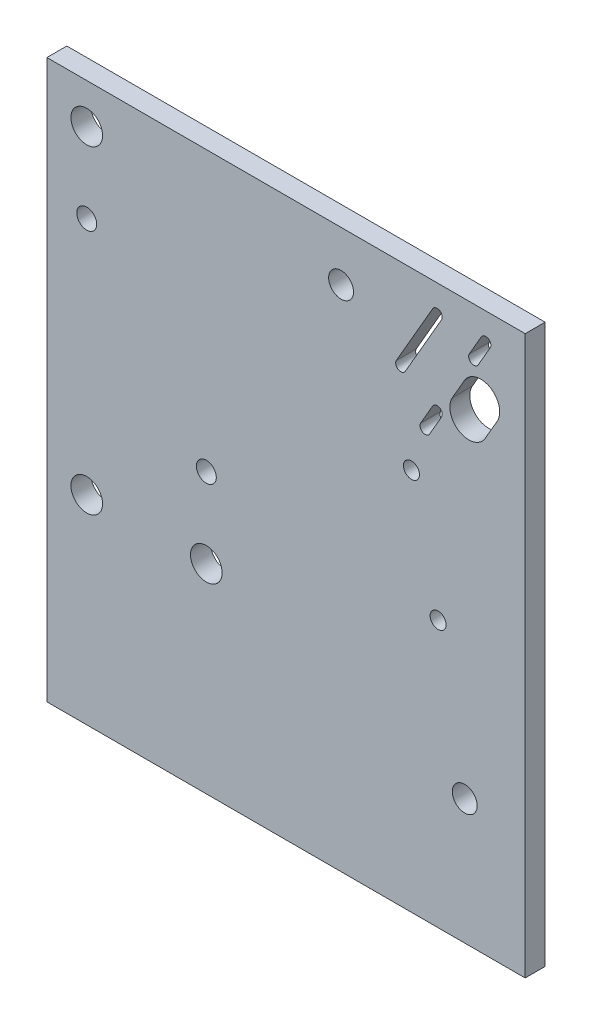
ISO-10303-21;
HEADER;
FILE_DESCRIPTION(('STEP AP214'),'2;1');
FILE_NAME('part.step','',(''),(''),'','','');
FILE_SCHEMA(('AUTOMOTIVE_DESIGN { 1 0 10303 214 1 1 1 1 }'));
ENDSEC;
DATA;
#1=APPLICATION_CONTEXT('core data for automotive mechanical design processes');
#2=APPLICATION_PROTOCOL_DEFINITION('international standard','automotive_design',2000,#1);
#3=PRODUCT_CONTEXT('',#1,'mechanical');
#4=PRODUCT('Part','Part','',(#3));
#5=PRODUCT_RELATED_PRODUCT_CATEGORY('part','',(#4));
#6=PRODUCT_DEFINITION_FORMATION('','',#4);
#7=PRODUCT_DEFINITION_CONTEXT('part definition',#1,'design');
#8=PRODUCT_DEFINITION('design','',#6,#7);
#9=PRODUCT_DEFINITION_SHAPE('','',#8);
#10=(LENGTH_UNIT() NAMED_UNIT(*) SI_UNIT(.MILLI.,.METRE.));
#11=(NAMED_UNIT(*) PLANE_ANGLE_UNIT() SI_UNIT($,.RADIAN.));
#12=(NAMED_UNIT(*) SI_UNIT($,.STERADIAN.) SOLID_ANGLE_UNIT());
#13=UNCERTAINTY_MEASURE_WITH_UNIT(LENGTH_MEASURE(1.E-05),#10,'distance_accuracy_value','');
#14=(GEOMETRIC_REPRESENTATION_CONTEXT(3) GLOBAL_UNCERTAINTY_ASSIGNED_CONTEXT((#13)) GLOBAL_UNIT_ASSIGNED_CONTEXT((#10,
#11,#12)) REPRESENTATION_CONTEXT('',''));
#15=CARTESIAN_POINT('',(0.,0.,0.));
#16=DIRECTION('',(0.,0.,1.));
#17=DIRECTION('',(1.,0.,0.));
#18=AXIS2_PLACEMENT_3D('',#15,#16,#17);
#19=CARTESIAN_POINT('',(0.,0.,6.35));
#20=DIRECTION('',(0.,1.,0.));
#21=DIRECTION('',(0.,0.,1.));
#22=AXIS2_PLACEMENT_3D('',#19,#20,#21);
#23=PLANE('',#22);
#24=DIRECTION('',(1.,0.,0.));
#25=VECTOR('',#24,1.);
#26=CARTESIAN_POINT('',(0.,0.,0.));
#27=LINE('',#26,#25);
#28=CARTESIAN_POINT('',(-152.4,0.,0.));
#29=VERTEX_POINT('',#28);
#30=CARTESIAN_POINT('',(0.,0.,0.));
#31=VERTEX_POINT('',#30);
#32=EDGE_CURVE('E450',#29,#31,#27,.T.);
#33=ORIENTED_EDGE('',*,*,#32,.T.);
#34=DIRECTION('',(0.,0.,-1.));
#35=VECTOR('',#34,1.);
#36=CARTESIAN_POINT('',(0.,0.,6.35));
#37=LINE('',#36,#35);
#38=CARTESIAN_POINT('',(0.,0.,6.35));
#39=VERTEX_POINT('',#38);
#40=EDGE_CURVE('E11',#39,#31,#37,.T.);
#41=ORIENTED_EDGE('',*,*,#40,.F.);
#42=DIRECTION('',(1.,0.,0.));
#43=VECTOR('',#42,1.);
#44=CARTESIAN_POINT('',(0.,0.,6.35));
#45=LINE('',#44,#43);
#46=CARTESIAN_POINT('',(-152.4,0.,6.35));
#47=VERTEX_POINT('',#46);
#48=EDGE_CURVE('E451',#47,#39,#45,.T.);
#49=ORIENTED_EDGE('',*,*,#48,.F.);
#50=DIRECTION('',(0.,0.,-1.));
#51=VECTOR('',#50,1.);
#52=CARTESIAN_POINT('',(-152.4,0.,6.35));
#53=LINE('',#52,#51);
#54=EDGE_CURVE('E463',#47,#29,#53,.T.);
#55=ORIENTED_EDGE('',*,*,#54,.T.);
#56=EDGE_LOOP('',(#33,#41,#49,#55));
#57=FACE_BOUND('',#56,.T.);
#58=ADVANCED_FACE('F49',(#57),#23,.F.);
#59=CARTESIAN_POINT('',(0.,0.,6.35));
#60=DIRECTION('',(-1.,0.,0.));
#61=DIRECTION('',(0.,0.,1.));
#62=AXIS2_PLACEMENT_3D('',#59,#60,#61);
#63=PLANE('',#62);
#64=DIRECTION('',(0.,1.,0.));
#65=VECTOR('',#64,1.);
#66=CARTESIAN_POINT('',(0.,0.,0.));
#67=LINE('',#66,#65);
#68=CARTESIAN_POINT('',(0.,177.8,0.));
#69=VERTEX_POINT('',#68);
#70=EDGE_CURVE('E467',#31,#69,#67,.T.);
#71=ORIENTED_EDGE('',*,*,#70,.T.);
#72=DIRECTION('',(0.,0.,-1.));
#73=VECTOR('',#72,1.);
#74=CARTESIAN_POINT('',(0.,177.8,6.35));
#75=LINE('',#74,#73);
#76=CARTESIAN_POINT('',(0.,177.8,6.35));
#77=VERTEX_POINT('',#76);
#78=EDGE_CURVE('E56',#77,#69,#75,.T.);
#79=ORIENTED_EDGE('',*,*,#78,.F.);
#80=DIRECTION('',(0.,1.,0.));
#81=VECTOR('',#80,1.);
#82=CARTESIAN_POINT('',(0.,0.,6.35));
#83=LINE('',#82,#81);
#84=EDGE_CURVE('E454',#39,#77,#83,.T.);
#85=ORIENTED_EDGE('',*,*,#84,.F.);
#86=ORIENTED_EDGE('',*,*,#40,.T.);
#87=EDGE_LOOP('',(#71,#79,#85,#86));
#88=FACE_BOUND('',#87,.T.);
#89=ADVANCED_FACE('F499',(#88),#63,.F.);
#90=CARTESIAN_POINT('',(0.,177.8,6.35));
#91=DIRECTION('',(0.,-1.,0.));
#92=DIRECTION('',(0.,0.,-1.));
#93=AXIS2_PLACEMENT_3D('',#90,#91,#92);
#94=PLANE('',#93);
#95=DIRECTION('',(-1.,0.,0.));
#96=VECTOR('',#95,1.);
#97=CARTESIAN_POINT('',(0.,177.8,0.));
#98=LINE('',#97,#96);
#99=CARTESIAN_POINT('',(-152.4,177.8,0.));
#100=VERTEX_POINT('',#99);
#101=EDGE_CURVE('E470',#69,#100,#98,.T.);
#102=ORIENTED_EDGE('',*,*,#101,.T.);
#103=DIRECTION('',(0.,0.,-1.));
#104=VECTOR('',#103,1.);
#105=CARTESIAN_POINT('',(-152.4,177.8,6.35));
#106=LINE('',#105,#104);
#107=CARTESIAN_POINT('',(-152.4,177.8,6.35));
#108=VERTEX_POINT('',#107);
#109=EDGE_CURVE('E477',#108,#100,#106,.T.);
#110=ORIENTED_EDGE('',*,*,#109,.F.);
#111=DIRECTION('',(-1.,0.,0.));
#112=VECTOR('',#111,1.);
#113=CARTESIAN_POINT('',(0.,177.8,6.35));
#114=LINE('',#113,#112);
#115=EDGE_CURVE('E457',#77,#108,#114,.T.);
#116=ORIENTED_EDGE('',*,*,#115,.F.);
#117=ORIENTED_EDGE('',*,*,#78,.T.);
#118=EDGE_LOOP('',(#102,#110,#116,#117));
#119=FACE_BOUND('',#118,.T.);
#120=ADVANCED_FACE('F484',(#119),#94,.F.);
#121=CARTESIAN_POINT('',(-152.4,0.,6.35));
#122=DIRECTION('',(1.,0.,0.));
#123=DIRECTION('',(0.,0.,-1.));
#124=AXIS2_PLACEMENT_3D('',#121,#122,#123);
#125=PLANE('',#124);
#126=DIRECTION('',(0.,-1.,0.));
#127=VECTOR('',#126,1.);
#128=CARTESIAN_POINT('',(-152.4,0.,0.));
#129=LINE('',#128,#127);
#130=EDGE_CURVE('E455',#100,#29,#129,.T.);
#131=ORIENTED_EDGE('',*,*,#130,.T.);
#132=ORIENTED_EDGE('',*,*,#54,.F.);
#133=DIRECTION('',(0.,-1.,0.));
#134=VECTOR('',#133,1.);
#135=CARTESIAN_POINT('',(-152.4,0.,6.35));
#136=LINE('',#135,#134);
#137=EDGE_CURVE('E460',#108,#47,#136,.T.);
#138=ORIENTED_EDGE('',*,*,#137,.F.);
#139=ORIENTED_EDGE('',*,*,#109,.T.);
#140=EDGE_LOOP('',(#131,#132,#138,#139));
#141=FACE_BOUND('',#140,.T.);
#142=ADVANCED_FACE('F493',(#141),#125,.F.);
#143=CARTESIAN_POINT('',(0.,0.,6.35));
#144=DIRECTION('',(0.,0.,-1.));
#145=DIRECTION('',(-1.,0.,0.));
#146=AXIS2_PLACEMENT_3D('',#143,#144,#145);
#147=PLANE('',#146);
#148=DIRECTION('',(0.5,0.866025403784438,0.));
#149=VECTOR('',#148,1.);
#150=CARTESIAN_POINT('',(-19.3851255766147,155.159806788419,6.35));
#151=LINE('',#150,#149);
#152=CARTESIAN_POINT('',(-23.1951255766147,148.560693211581,6.35));
#153=VERTEX_POINT('',#152);
#154=CARTESIAN_POINT('',(-19.3851255766147,155.159806788419,6.35));
#155=VERTEX_POINT('',#154);
#156=EDGE_CURVE('E222',#153,#155,#151,.T.);
#157=ORIENTED_EDGE('',*,*,#156,.T.);
#158=CARTESIAN_POINT('',(-14.1608273282851,152.143556788419,6.35));
#159=DIRECTION('',(0.,0.,-1.));
#160=DIRECTION('',(-1.,0.,0.));
#161=AXIS2_PLACEMENT_3D('',#158,#159,#160);
#162=CIRCLE('',#161,6.03249999999999);
#163=CARTESIAN_POINT('',(-8.93652907995543,149.127306788419,6.35));
#164=VERTEX_POINT('',#163);
#165=EDGE_CURVE('E215',#155,#164,#162,.T.);
#166=ORIENTED_EDGE('',*,*,#165,.T.);
#167=DIRECTION('',(-0.5,-0.866025403784438,0.));
#168=VECTOR('',#167,1.);
#169=CARTESIAN_POINT('',(-8.93652907995543,149.127306788419,6.35));
#170=LINE('',#169,#168);
#171=CARTESIAN_POINT('',(-12.7465290799554,142.528193211581,6.35));
#172=VERTEX_POINT('',#171);
#173=EDGE_CURVE('E225',#164,#172,#170,.T.);
#174=ORIENTED_EDGE('',*,*,#173,.T.);
#175=CARTESIAN_POINT('',(-17.970827328285,145.544443211581,6.35));
#176=DIRECTION('',(0.,0.,-1.));
#177=DIRECTION('',(-1.,0.,0.));
#178=AXIS2_PLACEMENT_3D('',#175,#176,#177);
#179=CIRCLE('',#178,6.03249999999999);
#180=EDGE_CURVE('E66',#172,#153,#179,.T.);
#181=ORIENTED_EDGE('',*,*,#180,.T.);
#182=EDGE_LOOP('',(#157,#166,#174,#181));
#183=FACE_BOUND('',#182,.T.);
#184=DIRECTION('',(0.499999999999992,0.866025403784443,0.));
#185=VECTOR('',#184,1.);
#186=CARTESIAN_POINT('',(-29.4803101577059,143.097334182183,6.35));
#187=LINE('',#186,#185);
#188=CARTESIAN_POINT('',(-33.2903101577059,136.498220605345,6.35));
#189=VERTEX_POINT('',#188);
#190=CARTESIAN_POINT('',(-29.4803101577059,143.097334182183,6.35));
#191=VERTEX_POINT('',#190);
#192=EDGE_CURVE('E276',#189,#191,#187,.T.);
#193=ORIENTED_EDGE('',*,*,#192,.T.);
#194=CARTESIAN_POINT('',(-28.0669999999999,142.281359182183,6.35));
#195=DIRECTION('',(0.,0.,-1.));
#196=DIRECTION('',(-1.,0.,0.));
#197=AXIS2_PLACEMENT_3D('',#194,#195,#196);
#198=CIRCLE('',#197,1.63195000000001);
#199=CARTESIAN_POINT('',(-26.6536898422939,141.465384182183,6.35));
#200=VERTEX_POINT('',#199);
#201=EDGE_CURVE('E263',#191,#200,#198,.T.);
#202=ORIENTED_EDGE('',*,*,#201,.T.);
#203=DIRECTION('',(-0.499999999999997,-0.86602540378444,0.));
#204=VECTOR('',#203,1.);
#205=CARTESIAN_POINT('',(-26.6536898422939,141.465384182183,6.35));
#206=LINE('',#205,#204);
#207=CARTESIAN_POINT('',(-30.4636898422939,134.866270605345,6.35));
#208=VERTEX_POINT('',#207);
#209=EDGE_CURVE('E267',#200,#208,#206,.T.);
#210=ORIENTED_EDGE('',*,*,#209,.T.);
#211=CARTESIAN_POINT('',(-31.8769999999999,135.682245605345,6.35));
#212=DIRECTION('',(0.,0.,-1.));
#213=DIRECTION('',(-1.,0.,0.));
#214=AXIS2_PLACEMENT_3D('',#211,#212,#213);
#215=CIRCLE('',#214,1.63194999999999);
#216=EDGE_CURVE('E272',#208,#189,#215,.T.);
#217=ORIENTED_EDGE('',*,*,#216,.T.);
#218=EDGE_LOOP('',(#193,#202,#210,#217));
#219=FACE_BOUND('',#218,.T.);
#220=DIRECTION('',(0.499999999999999,0.866025403784439,0.));
#221=VECTOR('',#220,1.);
#222=CARTESIAN_POINT('',(-29.4803101577061,169.933729394655,6.35));
#223=LINE('',#222,#221);
#224=CARTESIAN_POINT('',(-41.037310157706,149.916418211581,6.35));
#225=VERTEX_POINT('',#224);
#226=CARTESIAN_POINT('',(-29.4803101577061,169.933729394655,6.35));
#227=VERTEX_POINT('',#226);
#228=EDGE_CURVE('E312',#225,#227,#223,.T.);
#229=ORIENTED_EDGE('',*,*,#228,.T.);
#230=CARTESIAN_POINT('',(-28.067,169.117754394655,6.35));
#231=DIRECTION('',(0.,0.,-1.));
#232=DIRECTION('',(-1.,0.,0.));
#233=AXIS2_PLACEMENT_3D('',#230,#231,#232);
#234=CIRCLE('',#233,1.63194999999999);
#235=CARTESIAN_POINT('',(-26.653689842294,168.301779394655,6.35));
#236=VERTEX_POINT('',#235);
#237=EDGE_CURVE('E328',#227,#236,#234,.T.);
#238=ORIENTED_EDGE('',*,*,#237,.T.);
#239=DIRECTION('',(-0.499999999999999,-0.866025403784439,0.));
#240=VECTOR('',#239,1.);
#241=CARTESIAN_POINT('',(-26.653689842294,168.301779394655,6.35));
#242=LINE('',#241,#240);
#243=CARTESIAN_POINT('',(-38.210689842294,148.284468211581,6.35));
#244=VERTEX_POINT('',#243);
#245=EDGE_CURVE('E345',#236,#244,#242,.T.);
#246=ORIENTED_EDGE('',*,*,#245,.T.);
#247=CARTESIAN_POINT('',(-39.624,149.100443211581,6.35));
#248=DIRECTION('',(0.,0.,-1.));
#249=DIRECTION('',(-1.,0.,0.));
#250=AXIS2_PLACEMENT_3D('',#247,#248,#249);
#251=CIRCLE('',#250,1.63194999999999);
#252=EDGE_CURVE('E341',#244,#225,#251,.T.);
#253=ORIENTED_EDGE('',*,*,#252,.T.);
#254=EDGE_LOOP('',(#229,#238,#246,#253));
#255=FACE_BOUND('',#254,.T.);
#256=DIRECTION('',(0.499999999999998,0.86602540378444,0.));
#257=VECTOR('',#256,1.);
#258=CARTESIAN_POINT('',(-13.9863101577062,169.933729394655,6.35));
#259=LINE('',#258,#257);
#260=CARTESIAN_POINT('',(-17.7963101577062,163.334615817817,6.35));
#261=VERTEX_POINT('',#260);
#262=CARTESIAN_POINT('',(-13.9863101577062,169.933729394655,6.35));
#263=VERTEX_POINT('',#262);
#264=EDGE_CURVE('E355',#261,#263,#259,.T.);
#265=ORIENTED_EDGE('',*,*,#264,.T.);
#266=CARTESIAN_POINT('',(-12.5730000000002,169.117754394655,6.35));
#267=DIRECTION('',(0.,0.,-1.));
#268=DIRECTION('',(-1.,0.,0.));
#269=AXIS2_PLACEMENT_3D('',#266,#267,#268);
#270=CIRCLE('',#269,1.63195000000002);
#271=CARTESIAN_POINT('',(-11.1596898422942,168.301779394655,6.35));
#272=VERTEX_POINT('',#271);
#273=EDGE_CURVE('E368',#263,#272,#270,.T.);
#274=ORIENTED_EDGE('',*,*,#273,.T.);
#275=DIRECTION('',(-0.499999999999996,-0.866025403784441,0.));
#276=VECTOR('',#275,1.);
#277=CARTESIAN_POINT('',(-11.1596898422942,168.301779394655,6.35));
#278=LINE('',#277,#276);
#279=CARTESIAN_POINT('',(-14.9696898422941,161.702665817817,6.35));
#280=VERTEX_POINT('',#279);
#281=EDGE_CURVE('E384',#272,#280,#278,.T.);
#282=ORIENTED_EDGE('',*,*,#281,.T.);
#283=CARTESIAN_POINT('',(-16.3830000000002,162.518640817817,6.35));
#284=DIRECTION('',(0.,0.,-1.));
#285=DIRECTION('',(-1.,0.,0.));
#286=AXIS2_PLACEMENT_3D('',#283,#284,#285);
#287=CIRCLE('',#286,1.63195000000002);
#288=EDGE_CURVE('E380',#280,#261,#287,.T.);
#289=ORIENTED_EDGE('',*,*,#288,.T.);
#290=EDGE_LOOP('',(#265,#274,#282,#289));
#291=FACE_BOUND('',#290,.T.);
#292=CARTESIAN_POINT('',(-139.7,139.7,6.35));
#293=DIRECTION('',(0.,0.,-1.));
#294=DIRECTION('',(-1.,0.,0.));
#295=AXIS2_PLACEMENT_3D('',#292,#293,#294);
#296=CIRCLE('',#295,3.17500000000001);
#297=CARTESIAN_POINT('',(-142.875,139.7,6.35));
#298=VERTEX_POINT('',#297);
#299=EDGE_CURVE('E393',#298,#298,#296,.T.);
#300=ORIENTED_EDGE('',*,*,#299,.T.);
#301=EDGE_LOOP('',(#300));
#302=FACE_BOUND('',#301,.T.);
#303=CARTESIAN_POINT('',(-101.6,88.9,6.35));
#304=DIRECTION('',(0.,0.,-1.));
#305=DIRECTION('',(-1.,0.,0.));
#306=AXIS2_PLACEMENT_3D('',#303,#304,#305);
#307=CIRCLE('',#306,3.175);
#308=CARTESIAN_POINT('',(-104.775,88.9,6.35));
#309=VERTEX_POINT('',#308);
#310=EDGE_CURVE('E400',#309,#309,#307,.T.);
#311=ORIENTED_EDGE('',*,*,#310,.T.);
#312=EDGE_LOOP('',(#311));
#313=FACE_BOUND('',#312,.T.);
#314=CARTESIAN_POINT('',(-19.260612717749,39.8528944198345,6.35));
#315=DIRECTION('',(0.,0.,-1.));
#316=DIRECTION('',(-1.,0.,0.));
#317=AXIS2_PLACEMENT_3D('',#314,#315,#316);
#318=CIRCLE('',#317,3.96875);
#319=CARTESIAN_POINT('',(-23.229362717749,39.8528944198345,6.35));
#320=VERTEX_POINT('',#319);
#321=EDGE_CURVE('E406',#320,#320,#318,.T.);
#322=ORIENTED_EDGE('',*,*,#321,.T.);
#323=EDGE_LOOP('',(#322));
#324=FACE_BOUND('',#323,.T.);
#325=CARTESIAN_POINT('',(-58.6567098781925,161.952743754461,6.35));
#326=DIRECTION('',(0.,0.,-1.));
#327=DIRECTION('',(-1.,0.,0.));
#328=AXIS2_PLACEMENT_3D('',#325,#326,#327);
#329=CIRCLE('',#328,3.96875);
#330=CARTESIAN_POINT('',(-62.6254598781925,161.952743754461,6.35));
#331=VERTEX_POINT('',#330);
#332=EDGE_CURVE('E413',#331,#331,#329,.T.);
#333=ORIENTED_EDGE('',*,*,#332,.T.);
#334=EDGE_LOOP('',(#333));
#335=FACE_BOUND('',#334,.T.);
#336=CARTESIAN_POINT('',(-27.75458,84.8487,6.35));
#337=DIRECTION('',(0.,0.,1.));
#338=DIRECTION('',(1.,0.,0.));
#339=AXIS2_PLACEMENT_3D('',#336,#337,#338);
#340=CIRCLE('',#339,2.5527);
#341=CARTESIAN_POINT('',(-25.20188,84.8487,6.35));
#342=VERTEX_POINT('',#341);
#343=EDGE_CURVE('E417',#342,#342,#340,.T.);
#344=ORIENTED_EDGE('',*,*,#343,.F.);
#345=EDGE_LOOP('',(#344));
#346=FACE_BOUND('',#345,.T.);
#347=CARTESIAN_POINT('',(-36.24072,122.02414,6.35));
#348=DIRECTION('',(0.,0.,1.));
#349=DIRECTION('',(1.,0.,0.));
#350=AXIS2_PLACEMENT_3D('',#347,#348,#349);
#351=CIRCLE('',#350,2.5527);
#352=CARTESIAN_POINT('',(-33.68802,122.02414,6.35));
#353=VERTEX_POINT('',#352);
#354=EDGE_CURVE('E424',#353,#353,#351,.T.);
#355=ORIENTED_EDGE('',*,*,#354,.F.);
#356=EDGE_LOOP('',(#355));
#357=FACE_BOUND('',#356,.T.);
#358=CARTESIAN_POINT('',(-101.6,63.5,6.35));
#359=DIRECTION('',(0.,0.,1.));
#360=DIRECTION('',(1.,0.,0.));
#361=AXIS2_PLACEMENT_3D('',#358,#359,#360);
#362=CIRCLE('',#361,5.04189999999999);
#363=CARTESIAN_POINT('',(-96.5581,63.5,6.35));
#364=VERTEX_POINT('',#363);
#365=EDGE_CURVE('E431',#364,#364,#362,.T.);
#366=ORIENTED_EDGE('',*,*,#365,.F.);
#367=EDGE_LOOP('',(#366));
#368=FACE_BOUND('',#367,.T.);
#369=CARTESIAN_POINT('',(-139.7,63.5,6.35));
#370=DIRECTION('',(0.,0.,1.));
#371=DIRECTION('',(1.,0.,0.));
#372=AXIS2_PLACEMENT_3D('',#369,#370,#371);
#373=CIRCLE('',#372,5.04189999999999);
#374=CARTESIAN_POINT('',(-134.6581,63.5,6.35));
#375=VERTEX_POINT('',#374);
#376=EDGE_CURVE('E437',#375,#375,#373,.T.);
#377=ORIENTED_EDGE('',*,*,#376,.F.);
#378=EDGE_LOOP('',(#377));
#379=FACE_BOUND('',#378,.T.);
#380=CARTESIAN_POINT('',(-139.7,165.1,6.35));
#381=DIRECTION('',(0.,0.,1.));
#382=DIRECTION('',(1.,0.,0.));
#383=AXIS2_PLACEMENT_3D('',#380,#381,#382);
#384=CIRCLE('',#383,5.04189999999999);
#385=CARTESIAN_POINT('',(-134.6581,165.1,6.35));
#386=VERTEX_POINT('',#385);
#387=EDGE_CURVE('E443',#386,#386,#384,.T.);
#388=ORIENTED_EDGE('',*,*,#387,.F.);
#389=EDGE_LOOP('',(#388));
#390=FACE_BOUND('',#389,.T.);
#391=ORIENTED_EDGE('',*,*,#48,.T.);
#392=ORIENTED_EDGE('',*,*,#84,.T.);
#393=ORIENTED_EDGE('',*,*,#115,.T.);
#394=ORIENTED_EDGE('',*,*,#137,.T.);
#395=EDGE_LOOP('',(#391,#392,#393,#394));
#396=FACE_BOUND('',#395,.T.);
#397=ADVANCED_FACE('F230',(#183,#219,#255,#291,#302,#313,#324,#335,#346,#357,#368,#379,#390,
#396),#147,.F.);
#398=CARTESIAN_POINT('',(0.,0.,0.));
#399=DIRECTION('',(0.,0.,-1.));
#400=DIRECTION('',(-1.,0.,0.));
#401=AXIS2_PLACEMENT_3D('',#398,#399,#400);
#402=PLANE('',#401);
#403=CARTESIAN_POINT('',(-14.1608273282851,152.143556788419,0.));
#404=DIRECTION('',(0.,0.,-1.));
#405=DIRECTION('',(-1.,0.,0.));
#406=AXIS2_PLACEMENT_3D('',#403,#404,#405);
#407=CIRCLE('',#406,6.03249999999999);
#408=CARTESIAN_POINT('',(-19.3851255766147,155.159806788419,0.));
#409=VERTEX_POINT('',#408);
#410=CARTESIAN_POINT('',(-8.93652907995544,149.127306788419,0.));
#411=VERTEX_POINT('',#410);
#412=EDGE_CURVE('E76',#409,#411,#407,.T.);
#413=ORIENTED_EDGE('',*,*,#412,.F.);
#414=DIRECTION('',(0.5,0.866025403784438,0.));
#415=VECTOR('',#414,1.);
#416=CARTESIAN_POINT('',(-19.3851255766147,155.159806788419,0.));
#417=LINE('',#416,#415);
#418=CARTESIAN_POINT('',(-23.1951255766147,148.560693211581,0.));
#419=VERTEX_POINT('',#418);
#420=EDGE_CURVE('E234',#419,#409,#417,.T.);
#421=ORIENTED_EDGE('',*,*,#420,.F.);
#422=CARTESIAN_POINT('',(-17.970827328285,145.544443211581,0.));
#423=DIRECTION('',(0.,0.,-1.));
#424=DIRECTION('',(-1.,0.,0.));
#425=AXIS2_PLACEMENT_3D('',#422,#423,#424);
#426=CIRCLE('',#425,6.03249999999999);
#427=CARTESIAN_POINT('',(-12.7465290799554,142.528193211581,0.));
#428=VERTEX_POINT('',#427);
#429=EDGE_CURVE('E239',#428,#419,#426,.T.);
#430=ORIENTED_EDGE('',*,*,#429,.F.);
#431=DIRECTION('',(-0.5,-0.866025403784438,0.));
#432=VECTOR('',#431,1.);
#433=CARTESIAN_POINT('',(-8.93652907995543,149.127306788419,0.));
#434=LINE('',#433,#432);
#435=EDGE_CURVE('E248',#411,#428,#434,.T.);
#436=ORIENTED_EDGE('',*,*,#435,.F.);
#437=EDGE_LOOP('',(#413,#421,#430,#436));
#438=FACE_BOUND('',#437,.T.);
#439=CARTESIAN_POINT('',(-28.0669999999999,142.281359182183,0.));
#440=DIRECTION('',(0.,0.,-1.));
#441=DIRECTION('',(-1.,0.,0.));
#442=AXIS2_PLACEMENT_3D('',#439,#440,#441);
#443=CIRCLE('',#442,1.63195000000001);
#444=CARTESIAN_POINT('',(-29.4803101577059,143.097334182183,0.));
#445=VERTEX_POINT('',#444);
#446=CARTESIAN_POINT('',(-26.6536898422939,141.465384182183,0.));
#447=VERTEX_POINT('',#446);
#448=EDGE_CURVE('E280',#445,#447,#443,.T.);
#449=ORIENTED_EDGE('',*,*,#448,.F.);
#450=DIRECTION('',(0.499999999999992,0.866025403784443,0.));
#451=VECTOR('',#450,1.);
#452=CARTESIAN_POINT('',(-29.4803101577059,143.097334182183,0.));
#453=LINE('',#452,#451);
#454=CARTESIAN_POINT('',(-33.2903101577059,136.498220605345,0.));
#455=VERTEX_POINT('',#454);
#456=EDGE_CURVE('E268',#455,#445,#453,.T.);
#457=ORIENTED_EDGE('',*,*,#456,.F.);
#458=CARTESIAN_POINT('',(-31.8769999999999,135.682245605345,0.));
#459=DIRECTION('',(0.,0.,-1.));
#460=DIRECTION('',(-1.,0.,0.));
#461=AXIS2_PLACEMENT_3D('',#458,#459,#460);
#462=CIRCLE('',#461,1.63194999999999);
#463=CARTESIAN_POINT('',(-30.4636898422939,134.866270605345,0.));
#464=VERTEX_POINT('',#463);
#465=EDGE_CURVE('E288',#464,#455,#462,.T.);
#466=ORIENTED_EDGE('',*,*,#465,.F.);
#467=DIRECTION('',(-0.499999999999997,-0.86602540378444,0.));
#468=VECTOR('',#467,1.);
#469=CARTESIAN_POINT('',(-26.6536898422939,141.465384182183,0.));
#470=LINE('',#469,#468);
#471=EDGE_CURVE('E283',#447,#464,#470,.T.);
#472=ORIENTED_EDGE('',*,*,#471,.F.);
#473=EDGE_LOOP('',(#449,#457,#466,#472));
#474=FACE_BOUND('',#473,.T.);
#475=CARTESIAN_POINT('',(-28.067,169.117754394655,0.));
#476=DIRECTION('',(0.,0.,-1.));
#477=DIRECTION('',(-1.,0.,0.));
#478=AXIS2_PLACEMENT_3D('',#475,#476,#477);
#479=CIRCLE('',#478,1.63194999999999);
#480=CARTESIAN_POINT('',(-29.4803101577061,169.933729394655,0.));
#481=VERTEX_POINT('',#480);
#482=CARTESIAN_POINT('',(-26.653689842294,168.301779394655,0.));
#483=VERTEX_POINT('',#482);
#484=EDGE_CURVE('E284',#481,#483,#479,.T.);
#485=ORIENTED_EDGE('',*,*,#484,.F.);
#486=DIRECTION('',(0.499999999999999,0.866025403784439,0.));
#487=VECTOR('',#486,1.);
#488=CARTESIAN_POINT('',(-29.4803101577061,169.933729394655,0.));
#489=LINE('',#488,#487);
#490=CARTESIAN_POINT('',(-41.037310157706,149.916418211581,0.));
#491=VERTEX_POINT('',#490);
#492=EDGE_CURVE('E323',#491,#481,#489,.T.);
#493=ORIENTED_EDGE('',*,*,#492,.F.);
#494=CARTESIAN_POINT('',(-39.624,149.100443211581,0.));
#495=DIRECTION('',(0.,0.,-1.));
#496=DIRECTION('',(-1.,0.,0.));
#497=AXIS2_PLACEMENT_3D('',#494,#495,#496);
#498=CIRCLE('',#497,1.63194999999999);
#499=CARTESIAN_POINT('',(-38.210689842294,148.284468211581,0.));
#500=VERTEX_POINT('',#499);
#501=EDGE_CURVE('E327',#500,#491,#498,.T.);
#502=ORIENTED_EDGE('',*,*,#501,.F.);
#503=DIRECTION('',(-0.499999999999999,-0.866025403784439,0.));
#504=VECTOR('',#503,1.);
#505=CARTESIAN_POINT('',(-26.653689842294,168.301779394655,0.));
#506=LINE('',#505,#504);
#507=EDGE_CURVE('E332',#483,#500,#506,.T.);
#508=ORIENTED_EDGE('',*,*,#507,.F.);
#509=EDGE_LOOP('',(#485,#493,#502,#508));
#510=FACE_BOUND('',#509,.T.);
#511=CARTESIAN_POINT('',(-12.5730000000002,169.117754394655,0.));
#512=DIRECTION('',(0.,0.,-1.));
#513=DIRECTION('',(-1.,0.,0.));
#514=AXIS2_PLACEMENT_3D('',#511,#512,#513);
#515=CIRCLE('',#514,1.63195000000002);
#516=CARTESIAN_POINT('',(-13.9863101577062,169.933729394655,0.));
#517=VERTEX_POINT('',#516);
#518=CARTESIAN_POINT('',(-11.1596898422942,168.301779394655,0.));
#519=VERTEX_POINT('',#518);
#520=EDGE_CURVE('E322',#517,#519,#515,.T.);
#521=ORIENTED_EDGE('',*,*,#520,.F.);
#522=DIRECTION('',(0.499999999999998,0.86602540378444,0.));
#523=VECTOR('',#522,1.);
#524=CARTESIAN_POINT('',(-13.9863101577062,169.933729394655,0.));
#525=LINE('',#524,#523);
#526=CARTESIAN_POINT('',(-17.7963101577062,163.334615817817,0.));
#527=VERTEX_POINT('',#526);
#528=EDGE_CURVE('E363',#527,#517,#525,.T.);
#529=ORIENTED_EDGE('',*,*,#528,.F.);
#530=CARTESIAN_POINT('',(-16.3830000000002,162.518640817817,0.));
#531=DIRECTION('',(0.,0.,-1.));
#532=DIRECTION('',(-1.,0.,0.));
#533=AXIS2_PLACEMENT_3D('',#530,#531,#532);
#534=CIRCLE('',#533,1.63195000000002);
#535=CARTESIAN_POINT('',(-14.9696898422941,161.702665817817,0.));
#536=VERTEX_POINT('',#535);
#537=EDGE_CURVE('E367',#536,#527,#534,.T.);
#538=ORIENTED_EDGE('',*,*,#537,.F.);
#539=DIRECTION('',(-0.499999999999996,-0.866025403784441,0.));
#540=VECTOR('',#539,1.);
#541=CARTESIAN_POINT('',(-11.1596898422942,168.301779394655,0.));
#542=LINE('',#541,#540);
#543=EDGE_CURVE('E372',#519,#536,#542,.T.);
#544=ORIENTED_EDGE('',*,*,#543,.F.);
#545=EDGE_LOOP('',(#521,#529,#538,#544));
#546=FACE_BOUND('',#545,.T.);
#547=CARTESIAN_POINT('',(-139.7,139.7,0.));
#548=DIRECTION('',(0.,0.,-1.));
#549=DIRECTION('',(-1.,0.,0.));
#550=AXIS2_PLACEMENT_3D('',#547,#548,#549);
#551=CIRCLE('',#550,3.17500000000001);
#552=CARTESIAN_POINT('',(-142.875,139.7,0.));
#553=VERTEX_POINT('',#552);
#554=EDGE_CURVE('E298',#553,#553,#551,.T.);
#555=ORIENTED_EDGE('',*,*,#554,.F.);
#556=EDGE_LOOP('',(#555));
#557=FACE_BOUND('',#556,.T.);
#558=CARTESIAN_POINT('',(-101.6,88.9,0.));
#559=DIRECTION('',(0.,0.,-1.));
#560=DIRECTION('',(-1.,0.,0.));
#561=AXIS2_PLACEMENT_3D('',#558,#559,#560);
#562=CIRCLE('',#561,3.175);
#563=CARTESIAN_POINT('',(-104.775,88.9,0.));
#564=VERTEX_POINT('',#563);
#565=EDGE_CURVE('E397',#564,#564,#562,.T.);
#566=ORIENTED_EDGE('',*,*,#565,.F.);
#567=EDGE_LOOP('',(#566));
#568=FACE_BOUND('',#567,.T.);
#569=CARTESIAN_POINT('',(-19.260612717749,39.8528944198345,0.));
#570=DIRECTION('',(0.,0.,-1.));
#571=DIRECTION('',(-1.,0.,0.));
#572=AXIS2_PLACEMENT_3D('',#569,#570,#571);
#573=CIRCLE('',#572,3.96875);
#574=CARTESIAN_POINT('',(-23.229362717749,39.8528944198345,0.));
#575=VERTEX_POINT('',#574);
#576=EDGE_CURVE('E403',#575,#575,#573,.T.);
#577=ORIENTED_EDGE('',*,*,#576,.F.);
#578=EDGE_LOOP('',(#577));
#579=FACE_BOUND('',#578,.T.);
#580=CARTESIAN_POINT('',(-58.6567098781925,161.952743754461,0.));
#581=DIRECTION('',(0.,0.,-1.));
#582=DIRECTION('',(-1.,0.,0.));
#583=AXIS2_PLACEMENT_3D('',#580,#581,#582);
#584=CIRCLE('',#583,3.96875);
#585=CARTESIAN_POINT('',(-62.6254598781925,161.952743754461,0.));
#586=VERTEX_POINT('',#585);
#587=EDGE_CURVE('E409',#586,#586,#584,.T.);
#588=ORIENTED_EDGE('',*,*,#587,.F.);
#589=EDGE_LOOP('',(#588));
#590=FACE_BOUND('',#589,.T.);
#591=CARTESIAN_POINT('',(-27.75458,84.8487,0.));
#592=DIRECTION('',(0.,0.,1.));
#593=DIRECTION('',(1.,0.,0.));
#594=AXIS2_PLACEMENT_3D('',#591,#592,#593);
#595=CIRCLE('',#594,2.5527);
#596=CARTESIAN_POINT('',(-25.20188,84.8487,0.));
#597=VERTEX_POINT('',#596);
#598=EDGE_CURVE('E420',#597,#597,#595,.T.);
#599=ORIENTED_EDGE('',*,*,#598,.T.);
#600=EDGE_LOOP('',(#599));
#601=FACE_BOUND('',#600,.T.);
#602=CARTESIAN_POINT('',(-36.24072,122.02414,0.));
#603=DIRECTION('',(0.,0.,1.));
#604=DIRECTION('',(1.,0.,0.));
#605=AXIS2_PLACEMENT_3D('',#602,#603,#604);
#606=CIRCLE('',#605,2.5527);
#607=CARTESIAN_POINT('',(-33.68802,122.02414,0.));
#608=VERTEX_POINT('',#607);
#609=EDGE_CURVE('E427',#608,#608,#606,.T.);
#610=ORIENTED_EDGE('',*,*,#609,.T.);
#611=EDGE_LOOP('',(#610));
#612=FACE_BOUND('',#611,.T.);
#613=CARTESIAN_POINT('',(-101.6,63.5,0.));
#614=DIRECTION('',(0.,0.,1.));
#615=DIRECTION('',(1.,0.,0.));
#616=AXIS2_PLACEMENT_3D('',#613,#614,#615);
#617=CIRCLE('',#616,5.0419);
#618=CARTESIAN_POINT('',(-96.5581,63.5,0.));
#619=VERTEX_POINT('',#618);
#620=EDGE_CURVE('E434',#619,#619,#617,.T.);
#621=ORIENTED_EDGE('',*,*,#620,.T.);
#622=EDGE_LOOP('',(#621));
#623=FACE_BOUND('',#622,.T.);
#624=CARTESIAN_POINT('',(-139.7,63.5,0.));
#625=DIRECTION('',(0.,0.,1.));
#626=DIRECTION('',(1.,0.,0.));
#627=AXIS2_PLACEMENT_3D('',#624,#625,#626);
#628=CIRCLE('',#627,5.04189999999999);
#629=CARTESIAN_POINT('',(-134.6581,63.5,0.));
#630=VERTEX_POINT('',#629);
#631=EDGE_CURVE('E440',#630,#630,#628,.T.);
#632=ORIENTED_EDGE('',*,*,#631,.T.);
#633=EDGE_LOOP('',(#632));
#634=FACE_BOUND('',#633,.T.);
#635=CARTESIAN_POINT('',(-139.7,165.1,0.));
#636=DIRECTION('',(0.,0.,1.));
#637=DIRECTION('',(1.,0.,0.));
#638=AXIS2_PLACEMENT_3D('',#635,#636,#637);
#639=CIRCLE('',#638,5.04189999999999);
#640=CARTESIAN_POINT('',(-134.6581,165.1,0.));
#641=VERTEX_POINT('',#640);
#642=EDGE_CURVE('E447',#641,#641,#639,.T.);
#643=ORIENTED_EDGE('',*,*,#642,.T.);
#644=EDGE_LOOP('',(#643));
#645=FACE_BOUND('',#644,.T.);
#646=ORIENTED_EDGE('',*,*,#32,.F.);
#647=ORIENTED_EDGE('',*,*,#130,.F.);
#648=ORIENTED_EDGE('',*,*,#101,.F.);
#649=ORIENTED_EDGE('',*,*,#70,.F.);
#650=EDGE_LOOP('',(#646,#647,#648,#649));
#651=FACE_BOUND('',#650,.T.);
#652=ADVANCED_FACE('F490',(#438,#474,#510,#546,#557,#568,#579,#590,#601,#612,#623,#634,#645,
#651),#402,.T.);
#653=CARTESIAN_POINT('',(-139.7,165.1,6.35));
#654=DIRECTION('',(0.,0.,1.));
#655=DIRECTION('',(1.,0.,0.));
#656=AXIS2_PLACEMENT_3D('',#653,#654,#655);
#657=CYLINDRICAL_SURFACE('',#656,5.04189999999999);
#658=ORIENTED_EDGE('',*,*,#642,.F.);
#659=EDGE_LOOP('',(#658));
#660=FACE_BOUND('',#659,.T.);
#661=ORIENTED_EDGE('',*,*,#387,.T.);
#662=EDGE_LOOP('',(#661));
#663=FACE_BOUND('',#662,.T.);
#664=ADVANCED_FACE('F511',(#660,#663),#657,.F.);
#665=CARTESIAN_POINT('',(-139.7,63.5,6.35));
#666=DIRECTION('',(0.,0.,1.));
#667=DIRECTION('',(1.,0.,0.));
#668=AXIS2_PLACEMENT_3D('',#665,#666,#667);
#669=CYLINDRICAL_SURFACE('',#668,5.04189999999999);
#670=ORIENTED_EDGE('',*,*,#631,.F.);
#671=EDGE_LOOP('',(#670));
#672=FACE_BOUND('',#671,.T.);
#673=ORIENTED_EDGE('',*,*,#376,.T.);
#674=EDGE_LOOP('',(#673));
#675=FACE_BOUND('',#674,.T.);
#676=ADVANCED_FACE('F517',(#672,#675),#669,.F.);
#677=CARTESIAN_POINT('',(-101.6,63.5,6.35));
#678=DIRECTION('',(0.,0.,1.));
#679=DIRECTION('',(1.,0.,0.));
#680=AXIS2_PLACEMENT_3D('',#677,#678,#679);
#681=CYLINDRICAL_SURFACE('',#680,5.04189999999999);
#682=ORIENTED_EDGE('',*,*,#620,.F.);
#683=EDGE_LOOP('',(#682));
#684=FACE_BOUND('',#683,.T.);
#685=ORIENTED_EDGE('',*,*,#365,.T.);
#686=EDGE_LOOP('',(#685));
#687=FACE_BOUND('',#686,.T.);
#688=ADVANCED_FACE('F521',(#684,#687),#681,.F.);
#689=CARTESIAN_POINT('',(-36.24072,122.02414,6.35));
#690=DIRECTION('',(0.,0.,1.));
#691=DIRECTION('',(1.,0.,0.));
#692=AXIS2_PLACEMENT_3D('',#689,#690,#691);
#693=CYLINDRICAL_SURFACE('',#692,2.5527);
#694=ORIENTED_EDGE('',*,*,#609,.F.);
#695=EDGE_LOOP('',(#694));
#696=FACE_BOUND('',#695,.T.);
#697=ORIENTED_EDGE('',*,*,#354,.T.);
#698=EDGE_LOOP('',(#697));
#699=FACE_BOUND('',#698,.T.);
#700=ADVANCED_FACE('F525',(#696,#699),#693,.F.);
#701=CARTESIAN_POINT('',(-27.75458,84.8487,6.35));
#702=DIRECTION('',(0.,0.,1.));
#703=DIRECTION('',(1.,0.,0.));
#704=AXIS2_PLACEMENT_3D('',#701,#702,#703);
#705=CYLINDRICAL_SURFACE('',#704,2.5527);
#706=ORIENTED_EDGE('',*,*,#598,.F.);
#707=EDGE_LOOP('',(#706));
#708=FACE_BOUND('',#707,.T.);
#709=ORIENTED_EDGE('',*,*,#343,.T.);
#710=EDGE_LOOP('',(#709));
#711=FACE_BOUND('',#710,.T.);
#712=ADVANCED_FACE('F529',(#708,#711),#705,.F.);
#713=CARTESIAN_POINT('',(-58.6567098781925,161.952743754461,0.));
#714=DIRECTION('',(0.,0.,-1.));
#715=DIRECTION('',(-1.,0.,0.));
#716=AXIS2_PLACEMENT_3D('',#713,#714,#715);
#717=CYLINDRICAL_SURFACE('',#716,3.96875);
#718=ORIENTED_EDGE('',*,*,#332,.F.);
#719=EDGE_LOOP('',(#718));
#720=FACE_BOUND('',#719,.T.);
#721=ORIENTED_EDGE('',*,*,#587,.T.);
#722=EDGE_LOOP('',(#721));
#723=FACE_BOUND('',#722,.T.);
#724=ADVANCED_FACE('F533',(#720,#723),#717,.F.);
#725=CARTESIAN_POINT('',(-19.260612717749,39.8528944198345,0.));
#726=DIRECTION('',(0.,0.,-1.));
#727=DIRECTION('',(-1.,0.,0.));
#728=AXIS2_PLACEMENT_3D('',#725,#726,#727);
#729=CYLINDRICAL_SURFACE('',#728,3.96875);
#730=ORIENTED_EDGE('',*,*,#321,.F.);
#731=EDGE_LOOP('',(#730));
#732=FACE_BOUND('',#731,.T.);
#733=ORIENTED_EDGE('',*,*,#576,.T.);
#734=EDGE_LOOP('',(#733));
#735=FACE_BOUND('',#734,.T.);
#736=ADVANCED_FACE('F537',(#732,#735),#729,.F.);
#737=CARTESIAN_POINT('',(-101.6,88.9,0.));
#738=DIRECTION('',(0.,0.,-1.));
#739=DIRECTION('',(-1.,0.,0.));
#740=AXIS2_PLACEMENT_3D('',#737,#738,#739);
#741=CYLINDRICAL_SURFACE('',#740,3.175);
#742=ORIENTED_EDGE('',*,*,#310,.F.);
#743=EDGE_LOOP('',(#742));
#744=FACE_BOUND('',#743,.T.);
#745=ORIENTED_EDGE('',*,*,#565,.T.);
#746=EDGE_LOOP('',(#745));
#747=FACE_BOUND('',#746,.T.);
#748=ADVANCED_FACE('F541',(#744,#747),#741,.F.);
#749=CARTESIAN_POINT('',(-139.7,139.7,0.));
#750=DIRECTION('',(0.,0.,-1.));
#751=DIRECTION('',(-1.,0.,0.));
#752=AXIS2_PLACEMENT_3D('',#749,#750,#751);
#753=CYLINDRICAL_SURFACE('',#752,3.17500000000001);
#754=ORIENTED_EDGE('',*,*,#299,.F.);
#755=EDGE_LOOP('',(#754));
#756=FACE_BOUND('',#755,.T.);
#757=ORIENTED_EDGE('',*,*,#554,.T.);
#758=EDGE_LOOP('',(#757));
#759=FACE_BOUND('',#758,.T.);
#760=ADVANCED_FACE('F545',(#756,#759),#753,.F.);
#761=CARTESIAN_POINT('',(-12.5730000000002,169.117754394655,6.35));
#762=DIRECTION('',(0.,0.,-1.));
#763=DIRECTION('',(-1.,0.,0.));
#764=AXIS2_PLACEMENT_3D('',#761,#762,#763);
#765=CYLINDRICAL_SURFACE('',#764,1.63195000000002);
#766=ORIENTED_EDGE('',*,*,#520,.T.);
#767=DIRECTION('',(0.,0.,-1.));
#768=VECTOR('',#767,1.);
#769=CARTESIAN_POINT('',(-11.1596898422942,168.301779394655,6.35));
#770=LINE('',#769,#768);
#771=EDGE_CURVE('E352',#272,#519,#770,.T.);
#772=ORIENTED_EDGE('',*,*,#771,.F.);
#773=ORIENTED_EDGE('',*,*,#273,.F.);
#774=DIRECTION('',(0.,0.,-1.));
#775=VECTOR('',#774,1.);
#776=CARTESIAN_POINT('',(-13.9863101577062,169.933729394655,6.35));
#777=LINE('',#776,#775);
#778=EDGE_CURVE('E257',#263,#517,#777,.T.);
#779=ORIENTED_EDGE('',*,*,#778,.T.);
#780=EDGE_LOOP('',(#766,#772,#773,#779));
#781=FACE_BOUND('',#780,.T.);
#782=ADVANCED_FACE('F549',(#781),#765,.F.);
#783=CARTESIAN_POINT('',(-13.9863101577062,169.933729394655,6.35));
#784=DIRECTION('',(-0.86602540378444,0.499999999999997,0.));
#785=DIRECTION('',(-0.499999999999998,-0.86602540378444,0.));
#786=AXIS2_PLACEMENT_3D('',#783,#784,#785);
#787=PLANE('',#786);
#788=ORIENTED_EDGE('',*,*,#528,.T.);
#789=ORIENTED_EDGE('',*,*,#778,.F.);
#790=ORIENTED_EDGE('',*,*,#264,.F.);
#791=DIRECTION('',(0.,0.,-1.));
#792=VECTOR('',#791,1.);
#793=CARTESIAN_POINT('',(-17.7963101577062,163.334615817817,6.35));
#794=LINE('',#793,#792);
#795=EDGE_CURVE('E359',#261,#527,#794,.T.);
#796=ORIENTED_EDGE('',*,*,#795,.T.);
#797=EDGE_LOOP('',(#788,#789,#790,#796));
#798=FACE_BOUND('',#797,.T.);
#799=ADVANCED_FACE('F551',(#798),#787,.F.);
#800=CARTESIAN_POINT('',(-16.3830000000002,162.518640817817,6.35));
#801=DIRECTION('',(0.,0.,-1.));
#802=DIRECTION('',(-1.,0.,0.));
#803=AXIS2_PLACEMENT_3D('',#800,#801,#802);
#804=CYLINDRICAL_SURFACE('',#803,1.63195000000002);
#805=ORIENTED_EDGE('',*,*,#537,.T.);
#806=ORIENTED_EDGE('',*,*,#795,.F.);
#807=ORIENTED_EDGE('',*,*,#288,.F.);
#808=DIRECTION('',(0.,0.,-1.));
#809=VECTOR('',#808,1.);
#810=CARTESIAN_POINT('',(-14.9696898422941,161.702665817817,6.35));
#811=LINE('',#810,#809);
#812=EDGE_CURVE('E356',#280,#536,#811,.T.);
#813=ORIENTED_EDGE('',*,*,#812,.T.);
#814=EDGE_LOOP('',(#805,#806,#807,#813));
#815=FACE_BOUND('',#814,.T.);
#816=ADVANCED_FACE('F554',(#815),#804,.F.);
#817=CARTESIAN_POINT('',(-11.1596898422942,168.301779394655,6.35));
#818=DIRECTION('',(0.866025403784441,-0.499999999999996,0.));
#819=DIRECTION('',(0.499999999999996,0.866025403784441,0.));
#820=AXIS2_PLACEMENT_3D('',#817,#818,#819);
#821=PLANE('',#820);
#822=ORIENTED_EDGE('',*,*,#543,.T.);
#823=ORIENTED_EDGE('',*,*,#812,.F.);
#824=ORIENTED_EDGE('',*,*,#281,.F.);
#825=ORIENTED_EDGE('',*,*,#771,.T.);
#826=EDGE_LOOP('',(#822,#823,#824,#825));
#827=FACE_BOUND('',#826,.T.);
#828=ADVANCED_FACE('F558',(#827),#821,.F.);
#829=CARTESIAN_POINT('',(-28.067,169.117754394655,6.35));
#830=DIRECTION('',(0.,0.,-1.));
#831=DIRECTION('',(-1.,0.,0.));
#832=AXIS2_PLACEMENT_3D('',#829,#830,#831);
#833=CYLINDRICAL_SURFACE('',#832,1.63194999999999);
#834=ORIENTED_EDGE('',*,*,#484,.T.);
#835=DIRECTION('',(0.,0.,-1.));
#836=VECTOR('',#835,1.);
#837=CARTESIAN_POINT('',(-26.653689842294,168.301779394655,6.35));
#838=LINE('',#837,#836);
#839=EDGE_CURVE('E308',#236,#483,#838,.T.);
#840=ORIENTED_EDGE('',*,*,#839,.F.);
#841=ORIENTED_EDGE('',*,*,#237,.F.);
#842=DIRECTION('',(0.,0.,-1.));
#843=VECTOR('',#842,1.);
#844=CARTESIAN_POINT('',(-29.4803101577061,169.933729394655,6.35));
#845=LINE('',#844,#843);
#846=EDGE_CURVE('E319',#227,#481,#845,.T.);
#847=ORIENTED_EDGE('',*,*,#846,.T.);
#848=EDGE_LOOP('',(#834,#840,#841,#847));
#849=FACE_BOUND('',#848,.T.);
#850=ADVANCED_FACE('F562',(#849),#833,.F.);
#851=CARTESIAN_POINT('',(-29.4803101577061,169.933729394655,6.35));
#852=DIRECTION('',(-0.866025403784439,0.499999999999999,0.));
#853=DIRECTION('',(-0.499999999999999,-0.866025403784439,0.));
#854=AXIS2_PLACEMENT_3D('',#851,#852,#853);
#855=PLANE('',#854);
#856=ORIENTED_EDGE('',*,*,#492,.T.);
#857=ORIENTED_EDGE('',*,*,#846,.F.);
#858=ORIENTED_EDGE('',*,*,#228,.F.);
#859=DIRECTION('',(0.,0.,-1.));
#860=VECTOR('',#859,1.);
#861=CARTESIAN_POINT('',(-41.037310157706,149.916418211581,6.35));
#862=LINE('',#861,#860);
#863=EDGE_CURVE('E316',#225,#491,#862,.T.);
#864=ORIENTED_EDGE('',*,*,#863,.T.);
#865=EDGE_LOOP('',(#856,#857,#858,#864));
#866=FACE_BOUND('',#865,.T.);
#867=ADVANCED_FACE('F567',(#866),#855,.F.);
#868=CARTESIAN_POINT('',(-39.624,149.100443211581,6.35));
#869=DIRECTION('',(0.,0.,-1.));
#870=DIRECTION('',(-1.,0.,0.));
#871=AXIS2_PLACEMENT_3D('',#868,#869,#870);
#872=CYLINDRICAL_SURFACE('',#871,1.63194999999999);
#873=ORIENTED_EDGE('',*,*,#501,.T.);
#874=ORIENTED_EDGE('',*,*,#863,.F.);
#875=ORIENTED_EDGE('',*,*,#252,.F.);
#876=DIRECTION('',(0.,0.,-1.));
#877=VECTOR('',#876,1.);
#878=CARTESIAN_POINT('',(-38.210689842294,148.284468211581,6.35));
#879=LINE('',#878,#877);
#880=EDGE_CURVE('E313',#244,#500,#879,.T.);
#881=ORIENTED_EDGE('',*,*,#880,.T.);
#882=EDGE_LOOP('',(#873,#874,#875,#881));
#883=FACE_BOUND('',#882,.T.);
#884=ADVANCED_FACE('F570',(#883),#872,.F.);
#885=CARTESIAN_POINT('',(-26.653689842294,168.301779394655,6.35));
#886=DIRECTION('',(0.866025403784439,-0.499999999999999,0.));
#887=DIRECTION('',(0.499999999999999,0.866025403784439,0.));
#888=AXIS2_PLACEMENT_3D('',#885,#886,#887);
#889=PLANE('',#888);
#890=ORIENTED_EDGE('',*,*,#507,.T.);
#891=ORIENTED_EDGE('',*,*,#880,.F.);
#892=ORIENTED_EDGE('',*,*,#245,.F.);
#893=ORIENTED_EDGE('',*,*,#839,.T.);
#894=EDGE_LOOP('',(#890,#891,#892,#893));
#895=FACE_BOUND('',#894,.T.);
#896=ADVANCED_FACE('F574',(#895),#889,.F.);
#897=CARTESIAN_POINT('',(-28.0669999999999,142.281359182183,6.35));
#898=DIRECTION('',(0.,0.,-1.));
#899=DIRECTION('',(-1.,0.,0.));
#900=AXIS2_PLACEMENT_3D('',#897,#898,#899);
#901=CYLINDRICAL_SURFACE('',#900,1.63195000000001);
#902=ORIENTED_EDGE('',*,*,#448,.T.);
#903=DIRECTION('',(0.,0.,-1.));
#904=VECTOR('',#903,1.);
#905=CARTESIAN_POINT('',(-26.6536898422939,141.465384182183,6.35));
#906=LINE('',#905,#904);
#907=EDGE_CURVE('E279',#200,#447,#906,.T.);
#908=ORIENTED_EDGE('',*,*,#907,.F.);
#909=ORIENTED_EDGE('',*,*,#201,.F.);
#910=DIRECTION('',(0.,0.,-1.));
#911=VECTOR('',#910,1.);
#912=CARTESIAN_POINT('',(-29.4803101577059,143.097334182183,6.35));
#913=LINE('',#912,#911);
#914=EDGE_CURVE('E295',#191,#445,#913,.T.);
#915=ORIENTED_EDGE('',*,*,#914,.T.);
#916=EDGE_LOOP('',(#902,#908,#909,#915));
#917=FACE_BOUND('',#916,.T.);
#918=ADVANCED_FACE('F578',(#917),#901,.F.);
#919=CARTESIAN_POINT('',(-29.4803101577059,143.097334182183,6.35));
#920=DIRECTION('',(-0.866025403784443,0.499999999999992,0.));
#921=DIRECTION('',(-0.499999999999992,-0.866025403784443,0.));
#922=AXIS2_PLACEMENT_3D('',#919,#920,#921);
#923=PLANE('',#922);
#924=ORIENTED_EDGE('',*,*,#456,.T.);
#925=ORIENTED_EDGE('',*,*,#914,.F.);
#926=ORIENTED_EDGE('',*,*,#192,.F.);
#927=DIRECTION('',(0.,0.,-1.));
#928=VECTOR('',#927,1.);
#929=CARTESIAN_POINT('',(-33.2903101577059,136.498220605345,6.35));
#930=LINE('',#929,#928);
#931=EDGE_CURVE('E299',#189,#455,#930,.T.);
#932=ORIENTED_EDGE('',*,*,#931,.T.);
#933=EDGE_LOOP('',(#924,#925,#926,#932));
#934=FACE_BOUND('',#933,.T.);
#935=ADVANCED_FACE('F585',(#934),#923,.F.);
#936=CARTESIAN_POINT('',(-31.8769999999999,135.682245605345,6.35));
#937=DIRECTION('',(0.,0.,-1.));
#938=DIRECTION('',(-1.,0.,0.));
#939=AXIS2_PLACEMENT_3D('',#936,#937,#938);
#940=CYLINDRICAL_SURFACE('',#939,1.63194999999999);
#941=ORIENTED_EDGE('',*,*,#465,.T.);
#942=ORIENTED_EDGE('',*,*,#931,.F.);
#943=ORIENTED_EDGE('',*,*,#216,.F.);
#944=DIRECTION('',(0.,0.,-1.));
#945=VECTOR('',#944,1.);
#946=CARTESIAN_POINT('',(-30.4636898422939,134.866270605345,6.35));
#947=LINE('',#946,#945);
#948=EDGE_CURVE('E302',#208,#464,#947,.T.);
#949=ORIENTED_EDGE('',*,*,#948,.T.);
#950=EDGE_LOOP('',(#941,#942,#943,#949));
#951=FACE_BOUND('',#950,.T.);
#952=ADVANCED_FACE('F590',(#951),#940,.F.);
#953=CARTESIAN_POINT('',(-26.6536898422939,141.465384182183,6.35));
#954=DIRECTION('',(0.86602540378444,-0.499999999999997,0.));
#955=DIRECTION('',(0.499999999999997,0.86602540378444,0.));
#956=AXIS2_PLACEMENT_3D('',#953,#954,#955);
#957=PLANE('',#956);
#958=ORIENTED_EDGE('',*,*,#471,.T.);
#959=ORIENTED_EDGE('',*,*,#948,.F.);
#960=ORIENTED_EDGE('',*,*,#209,.F.);
#961=ORIENTED_EDGE('',*,*,#907,.T.);
#962=EDGE_LOOP('',(#958,#959,#960,#961));
#963=FACE_BOUND('',#962,.T.);
#964=ADVANCED_FACE('F587',(#963),#957,.F.);
#965=CARTESIAN_POINT('',(-14.1608273282851,152.143556788419,6.35));
#966=DIRECTION('',(0.,0.,-1.));
#967=DIRECTION('',(-1.,0.,0.));
#968=AXIS2_PLACEMENT_3D('',#965,#966,#967);
#969=CYLINDRICAL_SURFACE('',#968,6.03249999999999);
#970=ORIENTED_EDGE('',*,*,#412,.T.);
#971=DIRECTION('',(0.,0.,-1.));
#972=VECTOR('',#971,1.);
#973=CARTESIAN_POINT('',(-8.93652907995543,149.127306788419,6.35));
#974=LINE('',#973,#972);
#975=EDGE_CURVE('E211',#164,#411,#974,.T.);
#976=ORIENTED_EDGE('',*,*,#975,.F.);
#977=ORIENTED_EDGE('',*,*,#165,.F.);
#978=DIRECTION('',(0.,0.,-1.));
#979=VECTOR('',#978,1.);
#980=CARTESIAN_POINT('',(-19.3851255766147,155.159806788419,6.35));
#981=LINE('',#980,#979);
#982=EDGE_CURVE('E254',#155,#409,#981,.T.);
#983=ORIENTED_EDGE('',*,*,#982,.T.);
#984=EDGE_LOOP('',(#970,#976,#977,#983));
#985=FACE_BOUND('',#984,.T.);
#986=ADVANCED_FACE('F213',(#985),#969,.F.);
#987=CARTESIAN_POINT('',(-19.3851255766147,155.159806788419,6.35));
#988=DIRECTION('',(-0.866025403784438,0.5,0.));
#989=DIRECTION('',(-0.5,-0.866025403784439,0.));
#990=AXIS2_PLACEMENT_3D('',#987,#988,#989);
#991=PLANE('',#990);
#992=ORIENTED_EDGE('',*,*,#420,.T.);
#993=ORIENTED_EDGE('',*,*,#982,.F.);
#994=ORIENTED_EDGE('',*,*,#156,.F.);
#995=DIRECTION('',(0.,0.,-1.));
#996=VECTOR('',#995,1.);
#997=CARTESIAN_POINT('',(-23.1951255766147,148.560693211581,6.35));
#998=LINE('',#997,#996);
#999=EDGE_CURVE('E258',#153,#419,#998,.T.);
#1000=ORIENTED_EDGE('',*,*,#999,.T.);
#1001=EDGE_LOOP('',(#992,#993,#994,#1000));
#1002=FACE_BOUND('',#1001,.T.);
#1003=ADVANCED_FACE('F600',(#1002),#991,.F.);
#1004=CARTESIAN_POINT('',(-17.970827328285,145.544443211581,6.35));
#1005=DIRECTION('',(0.,0.,-1.));
#1006=DIRECTION('',(-1.,0.,0.));
#1007=AXIS2_PLACEMENT_3D('',#1004,#1005,#1006);
#1008=CYLINDRICAL_SURFACE('',#1007,6.03249999999999);
#1009=ORIENTED_EDGE('',*,*,#429,.T.);
#1010=ORIENTED_EDGE('',*,*,#999,.F.);
#1011=ORIENTED_EDGE('',*,*,#180,.F.);
#1012=DIRECTION('',(0.,0.,-1.));
#1013=VECTOR('',#1012,1.);
#1014=CARTESIAN_POINT('',(-12.7465290799554,142.528193211581,6.35));
#1015=LINE('',#1014,#1013);
#1016=EDGE_CURVE('E221',#172,#428,#1015,.T.);
#1017=ORIENTED_EDGE('',*,*,#1016,.T.);
#1018=EDGE_LOOP('',(#1009,#1010,#1011,#1017));
#1019=FACE_BOUND('',#1018,.T.);
#1020=ADVANCED_FACE('F603',(#1019),#1008,.F.);
#1021=CARTESIAN_POINT('',(-8.93652907995543,149.127306788419,6.35));
#1022=DIRECTION('',(0.866025403784438,-0.5,0.));
#1023=DIRECTION('',(0.5,0.866025403784439,0.));
#1024=AXIS2_PLACEMENT_3D('',#1021,#1022,#1023);
#1025=PLANE('',#1024);
#1026=ORIENTED_EDGE('',*,*,#435,.T.);
#1027=ORIENTED_EDGE('',*,*,#1016,.F.);
#1028=ORIENTED_EDGE('',*,*,#173,.F.);
#1029=ORIENTED_EDGE('',*,*,#975,.T.);
#1030=EDGE_LOOP('',(#1026,#1027,#1028,#1029));
#1031=FACE_BOUND('',#1030,.T.);
#1032=ADVANCED_FACE('F226',(#1031),#1025,.F.);
#1033=CLOSED_SHELL('',(#58,#89,#120,#142,#397,#652,#664,#676,#688,#700,#712,#724,#736,#748,#760,
#782,#799,#816,#828,#850,#867,#884,#896,#918,#935,#952,#964,#986,#1003,#1020,#1032));
#1034=MANIFOLD_SOLID_BREP('B2',#1033);
#1035=ADVANCED_BREP_SHAPE_REPRESENTATION('',(#18,#1034),#14);
#1036=SHAPE_DEFINITION_REPRESENTATION(#9,#1035);
ENDSEC;
END-ISO-10303-21;
